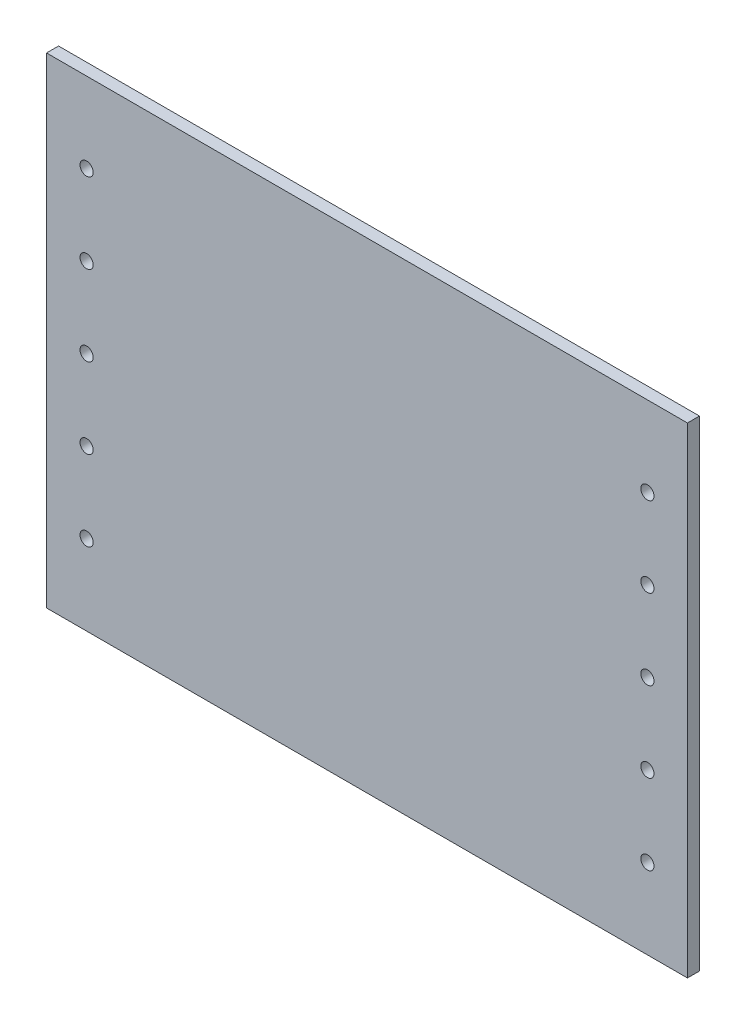
ISO-10303-21;
HEADER;
FILE_DESCRIPTION(('STEP AP214'),'2;1');
FILE_NAME('part.step','',(''),(''),'','','');
FILE_SCHEMA(('AUTOMOTIVE_DESIGN { 1 0 10303 214 1 1 1 1 }'));
ENDSEC;
DATA;
#1=APPLICATION_CONTEXT('core data for automotive mechanical design processes');
#2=APPLICATION_PROTOCOL_DEFINITION('international standard','automotive_design',2000,#1);
#3=PRODUCT_CONTEXT('',#1,'mechanical');
#4=PRODUCT('Part','Part','',(#3));
#5=PRODUCT_RELATED_PRODUCT_CATEGORY('part','',(#4));
#6=PRODUCT_DEFINITION_FORMATION('','',#4);
#7=PRODUCT_DEFINITION_CONTEXT('part definition',#1,'design');
#8=PRODUCT_DEFINITION('design','',#6,#7);
#9=PRODUCT_DEFINITION_SHAPE('','',#8);
#10=(LENGTH_UNIT() NAMED_UNIT(*) SI_UNIT(.MILLI.,.METRE.));
#11=(NAMED_UNIT(*) PLANE_ANGLE_UNIT() SI_UNIT($,.RADIAN.));
#12=(NAMED_UNIT(*) SI_UNIT($,.STERADIAN.) SOLID_ANGLE_UNIT());
#13=UNCERTAINTY_MEASURE_WITH_UNIT(LENGTH_MEASURE(1.E-05),#10,'distance_accuracy_value','');
#14=(GEOMETRIC_REPRESENTATION_CONTEXT(3) GLOBAL_UNCERTAINTY_ASSIGNED_CONTEXT((#13)) GLOBAL_UNIT_ASSIGNED_CONTEXT((#10,
#11,#12)) REPRESENTATION_CONTEXT('',''));
#15=CARTESIAN_POINT('',(0.,0.,0.));
#16=DIRECTION('',(0.,0.,1.));
#17=DIRECTION('',(1.,0.,0.));
#18=AXIS2_PLACEMENT_3D('',#15,#16,#17);
#19=CARTESIAN_POINT('',(0.,0.,3.));
#20=DIRECTION('',(0.,0.,1.));
#21=DIRECTION('',(1.,0.,0.));
#22=AXIS2_PLACEMENT_3D('',#19,#20,#21);
#23=PLANE('',#22);
#24=CARTESIAN_POINT('',(70.,20.,3.));
#25=DIRECTION('',(0.,0.,1.));
#26=DIRECTION('',(-1.,0.,0.));
#27=AXIS2_PLACEMENT_3D('',#24,#25,#26);
#28=CIRCLE('',#27,1.65);
#29=CARTESIAN_POINT('',(68.35,20.,3.));
#30=VERTEX_POINT('',#29);
#31=EDGE_CURVE('E165',#30,#30,#28,.T.);
#32=ORIENTED_EDGE('',*,*,#31,.F.);
#33=EDGE_LOOP('',(#32));
#34=FACE_BOUND('',#33,.T.);
#35=CARTESIAN_POINT('',(70.,-20.,3.));
#36=DIRECTION('',(0.,0.,1.));
#37=DIRECTION('',(-1.,0.,0.));
#38=AXIS2_PLACEMENT_3D('',#35,#36,#37);
#39=CIRCLE('',#38,1.64999999999999);
#40=CARTESIAN_POINT('',(68.35,-20.,3.));
#41=VERTEX_POINT('',#40);
#42=EDGE_CURVE('E153',#41,#41,#39,.T.);
#43=ORIENTED_EDGE('',*,*,#42,.F.);
#44=EDGE_LOOP('',(#43));
#45=FACE_BOUND('',#44,.T.);
#46=CARTESIAN_POINT('',(-70.,-40.,3.));
#47=DIRECTION('',(0.,0.,1.));
#48=DIRECTION('',(1.,0.,0.));
#49=AXIS2_PLACEMENT_3D('',#46,#47,#48);
#50=CIRCLE('',#49,1.65);
#51=CARTESIAN_POINT('',(-68.35,-40.,3.));
#52=VERTEX_POINT('',#51);
#53=EDGE_CURVE('E141',#52,#52,#50,.T.);
#54=ORIENTED_EDGE('',*,*,#53,.F.);
#55=EDGE_LOOP('',(#54));
#56=FACE_BOUND('',#55,.T.);
#57=CARTESIAN_POINT('',(-70.,0.,3.));
#58=DIRECTION('',(0.,0.,1.));
#59=DIRECTION('',(1.,0.,0.));
#60=AXIS2_PLACEMENT_3D('',#57,#58,#59);
#61=CIRCLE('',#60,1.65);
#62=CARTESIAN_POINT('',(-68.35,0.,3.));
#63=VERTEX_POINT('',#62);
#64=EDGE_CURVE('E129',#63,#63,#61,.T.);
#65=ORIENTED_EDGE('',*,*,#64,.F.);
#66=EDGE_LOOP('',(#65));
#67=FACE_BOUND('',#66,.T.);
#68=CARTESIAN_POINT('',(-70.,40.,3.));
#69=DIRECTION('',(0.,0.,1.));
#70=DIRECTION('',(1.,0.,0.));
#71=AXIS2_PLACEMENT_3D('',#68,#69,#70);
#72=CIRCLE('',#71,1.65);
#73=CARTESIAN_POINT('',(-68.35,40.,3.));
#74=VERTEX_POINT('',#73);
#75=EDGE_CURVE('E108',#74,#74,#72,.T.);
#76=ORIENTED_EDGE('',*,*,#75,.F.);
#77=EDGE_LOOP('',(#76));
#78=FACE_BOUND('',#77,.T.);
#79=DIRECTION('',(0.,1.,0.));
#80=VECTOR('',#79,1.);
#81=CARTESIAN_POINT('',(80.,60.,3.));
#82=LINE('',#81,#80);
#83=CARTESIAN_POINT('',(80.,-60.,3.));
#84=VERTEX_POINT('',#83);
#85=CARTESIAN_POINT('',(80.,60.,3.));
#86=VERTEX_POINT('',#85);
#87=EDGE_CURVE('E93',#84,#86,#82,.T.);
#88=ORIENTED_EDGE('',*,*,#87,.T.);
#89=DIRECTION('',(-1.,0.,0.));
#90=VECTOR('',#89,1.);
#91=CARTESIAN_POINT('',(-80.,60.,3.));
#92=LINE('',#91,#90);
#93=CARTESIAN_POINT('',(-80.,60.,3.));
#94=VERTEX_POINT('',#93);
#95=EDGE_CURVE('E88',#86,#94,#92,.T.);
#96=ORIENTED_EDGE('',*,*,#95,.T.);
#97=DIRECTION('',(0.,-1.,0.));
#98=VECTOR('',#97,1.);
#99=CARTESIAN_POINT('',(-80.,60.,3.));
#100=LINE('',#99,#98);
#101=CARTESIAN_POINT('',(-80.,-60.,3.));
#102=VERTEX_POINT('',#101);
#103=EDGE_CURVE('E91',#94,#102,#100,.T.);
#104=ORIENTED_EDGE('',*,*,#103,.T.);
#105=DIRECTION('',(1.,0.,0.));
#106=VECTOR('',#105,1.);
#107=CARTESIAN_POINT('',(-80.,-60.,3.));
#108=LINE('',#107,#106);
#109=EDGE_CURVE('E58',#102,#84,#108,.T.);
#110=ORIENTED_EDGE('',*,*,#109,.T.);
#111=EDGE_LOOP('',(#88,#96,#104,#110));
#112=FACE_BOUND('',#111,.T.);
#113=CARTESIAN_POINT('',(-70.,20.,3.));
#114=DIRECTION('',(0.,0.,1.));
#115=DIRECTION('',(1.,0.,0.));
#116=AXIS2_PLACEMENT_3D('',#113,#114,#115);
#117=CIRCLE('',#116,1.65);
#118=CARTESIAN_POINT('',(-68.35,20.,3.));
#119=VERTEX_POINT('',#118);
#120=EDGE_CURVE('E123',#119,#119,#117,.T.);
#121=ORIENTED_EDGE('',*,*,#120,.F.);
#122=EDGE_LOOP('',(#121));
#123=FACE_BOUND('',#122,.T.);
#124=CARTESIAN_POINT('',(-70.,-20.,3.));
#125=DIRECTION('',(0.,0.,1.));
#126=DIRECTION('',(1.,0.,0.));
#127=AXIS2_PLACEMENT_3D('',#124,#125,#126);
#128=CIRCLE('',#127,1.64999999999999);
#129=CARTESIAN_POINT('',(-68.35,-20.,3.));
#130=VERTEX_POINT('',#129);
#131=EDGE_CURVE('E135',#130,#130,#128,.T.);
#132=ORIENTED_EDGE('',*,*,#131,.F.);
#133=EDGE_LOOP('',(#132));
#134=FACE_BOUND('',#133,.T.);
#135=CARTESIAN_POINT('',(70.,-40.,3.));
#136=DIRECTION('',(0.,0.,1.));
#137=DIRECTION('',(-1.,0.,0.));
#138=AXIS2_PLACEMENT_3D('',#135,#136,#137);
#139=CIRCLE('',#138,1.65);
#140=CARTESIAN_POINT('',(68.35,-40.,3.));
#141=VERTEX_POINT('',#140);
#142=EDGE_CURVE('E147',#141,#141,#139,.T.);
#143=ORIENTED_EDGE('',*,*,#142,.F.);
#144=EDGE_LOOP('',(#143));
#145=FACE_BOUND('',#144,.T.);
#146=CARTESIAN_POINT('',(70.,0.,3.));
#147=DIRECTION('',(0.,0.,1.));
#148=DIRECTION('',(-1.,0.,0.));
#149=AXIS2_PLACEMENT_3D('',#146,#147,#148);
#150=CIRCLE('',#149,1.65);
#151=CARTESIAN_POINT('',(68.35,0.,3.));
#152=VERTEX_POINT('',#151);
#153=EDGE_CURVE('E159',#152,#152,#150,.T.);
#154=ORIENTED_EDGE('',*,*,#153,.F.);
#155=EDGE_LOOP('',(#154));
#156=FACE_BOUND('',#155,.T.);
#157=CARTESIAN_POINT('',(70.,40.,3.));
#158=DIRECTION('',(0.,0.,1.));
#159=DIRECTION('',(-1.,0.,0.));
#160=AXIS2_PLACEMENT_3D('',#157,#158,#159);
#161=CIRCLE('',#160,1.65);
#162=CARTESIAN_POINT('',(68.35,40.,3.));
#163=VERTEX_POINT('',#162);
#164=EDGE_CURVE('E171',#163,#163,#161,.T.);
#165=ORIENTED_EDGE('',*,*,#164,.F.);
#166=EDGE_LOOP('',(#165));
#167=FACE_BOUND('',#166,.T.);
#168=ADVANCED_FACE('F41',(#34,#45,#56,#67,#78,#112,#123,#134,#145,#156,#167),#23,.T.);
#169=CARTESIAN_POINT('',(0.,0.,0.));
#170=DIRECTION('',(0.,0.,1.));
#171=DIRECTION('',(1.,0.,0.));
#172=AXIS2_PLACEMENT_3D('',#169,#170,#171);
#173=PLANE('',#172);
#174=DIRECTION('',(0.,1.,0.));
#175=VECTOR('',#174,1.);
#176=CARTESIAN_POINT('',(80.,60.,0.));
#177=LINE('',#176,#175);
#178=CARTESIAN_POINT('',(80.,-60.,0.));
#179=VERTEX_POINT('',#178);
#180=CARTESIAN_POINT('',(80.,60.,0.));
#181=VERTEX_POINT('',#180);
#182=EDGE_CURVE('E105',#179,#181,#177,.T.);
#183=ORIENTED_EDGE('',*,*,#182,.F.);
#184=DIRECTION('',(1.,0.,0.));
#185=VECTOR('',#184,1.);
#186=CARTESIAN_POINT('',(-80.,-60.,0.));
#187=LINE('',#186,#185);
#188=CARTESIAN_POINT('',(-80.,-60.,0.));
#189=VERTEX_POINT('',#188);
#190=EDGE_CURVE('E81',#189,#179,#187,.T.);
#191=ORIENTED_EDGE('',*,*,#190,.F.);
#192=DIRECTION('',(0.,-1.,0.));
#193=VECTOR('',#192,1.);
#194=CARTESIAN_POINT('',(-80.,60.,0.));
#195=LINE('',#194,#193);
#196=CARTESIAN_POINT('',(-80.,60.,0.));
#197=VERTEX_POINT('',#196);
#198=EDGE_CURVE('E75',#197,#189,#195,.T.);
#199=ORIENTED_EDGE('',*,*,#198,.F.);
#200=DIRECTION('',(-1.,0.,0.));
#201=VECTOR('',#200,1.);
#202=CARTESIAN_POINT('',(-80.,60.,0.));
#203=LINE('',#202,#201);
#204=EDGE_CURVE('E97',#181,#197,#203,.T.);
#205=ORIENTED_EDGE('',*,*,#204,.F.);
#206=EDGE_LOOP('',(#183,#191,#199,#205));
#207=FACE_BOUND('',#206,.T.);
#208=CARTESIAN_POINT('',(-70.,40.,0.));
#209=DIRECTION('',(0.,0.,1.));
#210=DIRECTION('',(1.,0.,0.));
#211=AXIS2_PLACEMENT_3D('',#208,#209,#210);
#212=CIRCLE('',#211,1.65);
#213=CARTESIAN_POINT('',(-68.35,40.,0.));
#214=VERTEX_POINT('',#213);
#215=EDGE_CURVE('E120',#214,#214,#212,.T.);
#216=ORIENTED_EDGE('',*,*,#215,.T.);
#217=EDGE_LOOP('',(#216));
#218=FACE_BOUND('',#217,.T.);
#219=CARTESIAN_POINT('',(-70.,20.,0.));
#220=DIRECTION('',(0.,0.,1.));
#221=DIRECTION('',(1.,0.,0.));
#222=AXIS2_PLACEMENT_3D('',#219,#220,#221);
#223=CIRCLE('',#222,1.65);
#224=CARTESIAN_POINT('',(-68.35,20.,0.));
#225=VERTEX_POINT('',#224);
#226=EDGE_CURVE('E126',#225,#225,#223,.T.);
#227=ORIENTED_EDGE('',*,*,#226,.T.);
#228=EDGE_LOOP('',(#227));
#229=FACE_BOUND('',#228,.T.);
#230=CARTESIAN_POINT('',(-70.,0.,0.));
#231=DIRECTION('',(0.,0.,1.));
#232=DIRECTION('',(1.,0.,0.));
#233=AXIS2_PLACEMENT_3D('',#230,#231,#232);
#234=CIRCLE('',#233,1.65);
#235=CARTESIAN_POINT('',(-68.35,0.,0.));
#236=VERTEX_POINT('',#235);
#237=EDGE_CURVE('E132',#236,#236,#234,.T.);
#238=ORIENTED_EDGE('',*,*,#237,.T.);
#239=EDGE_LOOP('',(#238));
#240=FACE_BOUND('',#239,.T.);
#241=CARTESIAN_POINT('',(-70.,-20.,0.));
#242=DIRECTION('',(0.,0.,1.));
#243=DIRECTION('',(1.,0.,0.));
#244=AXIS2_PLACEMENT_3D('',#241,#242,#243);
#245=CIRCLE('',#244,1.64999999999999);
#246=CARTESIAN_POINT('',(-68.35,-20.,0.));
#247=VERTEX_POINT('',#246);
#248=EDGE_CURVE('E138',#247,#247,#245,.T.);
#249=ORIENTED_EDGE('',*,*,#248,.T.);
#250=EDGE_LOOP('',(#249));
#251=FACE_BOUND('',#250,.T.);
#252=CARTESIAN_POINT('',(-70.,-40.,0.));
#253=DIRECTION('',(0.,0.,1.));
#254=DIRECTION('',(1.,0.,0.));
#255=AXIS2_PLACEMENT_3D('',#252,#253,#254);
#256=CIRCLE('',#255,1.65);
#257=CARTESIAN_POINT('',(-68.35,-40.,0.));
#258=VERTEX_POINT('',#257);
#259=EDGE_CURVE('E144',#258,#258,#256,.T.);
#260=ORIENTED_EDGE('',*,*,#259,.T.);
#261=EDGE_LOOP('',(#260));
#262=FACE_BOUND('',#261,.T.);
#263=CARTESIAN_POINT('',(70.,-40.,0.));
#264=DIRECTION('',(0.,0.,1.));
#265=DIRECTION('',(-1.,0.,0.));
#266=AXIS2_PLACEMENT_3D('',#263,#264,#265);
#267=CIRCLE('',#266,1.65);
#268=CARTESIAN_POINT('',(68.35,-40.,0.));
#269=VERTEX_POINT('',#268);
#270=EDGE_CURVE('E150',#269,#269,#267,.T.);
#271=ORIENTED_EDGE('',*,*,#270,.T.);
#272=EDGE_LOOP('',(#271));
#273=FACE_BOUND('',#272,.T.);
#274=CARTESIAN_POINT('',(70.,-20.,0.));
#275=DIRECTION('',(0.,0.,1.));
#276=DIRECTION('',(-1.,0.,0.));
#277=AXIS2_PLACEMENT_3D('',#274,#275,#276);
#278=CIRCLE('',#277,1.64999999999999);
#279=CARTESIAN_POINT('',(68.35,-20.,0.));
#280=VERTEX_POINT('',#279);
#281=EDGE_CURVE('E156',#280,#280,#278,.T.);
#282=ORIENTED_EDGE('',*,*,#281,.T.);
#283=EDGE_LOOP('',(#282));
#284=FACE_BOUND('',#283,.T.);
#285=CARTESIAN_POINT('',(70.,0.,0.));
#286=DIRECTION('',(0.,0.,1.));
#287=DIRECTION('',(-1.,0.,0.));
#288=AXIS2_PLACEMENT_3D('',#285,#286,#287);
#289=CIRCLE('',#288,1.65);
#290=CARTESIAN_POINT('',(68.35,0.,0.));
#291=VERTEX_POINT('',#290);
#292=EDGE_CURVE('E162',#291,#291,#289,.T.);
#293=ORIENTED_EDGE('',*,*,#292,.T.);
#294=EDGE_LOOP('',(#293));
#295=FACE_BOUND('',#294,.T.);
#296=CARTESIAN_POINT('',(70.,20.,0.));
#297=DIRECTION('',(0.,0.,1.));
#298=DIRECTION('',(-1.,0.,0.));
#299=AXIS2_PLACEMENT_3D('',#296,#297,#298);
#300=CIRCLE('',#299,1.65);
#301=CARTESIAN_POINT('',(68.35,20.,0.));
#302=VERTEX_POINT('',#301);
#303=EDGE_CURVE('E168',#302,#302,#300,.T.);
#304=ORIENTED_EDGE('',*,*,#303,.T.);
#305=EDGE_LOOP('',(#304));
#306=FACE_BOUND('',#305,.T.);
#307=CARTESIAN_POINT('',(70.,40.,0.));
#308=DIRECTION('',(0.,0.,1.));
#309=DIRECTION('',(-1.,0.,0.));
#310=AXIS2_PLACEMENT_3D('',#307,#308,#309);
#311=CIRCLE('',#310,1.65);
#312=CARTESIAN_POINT('',(68.35,40.,0.));
#313=VERTEX_POINT('',#312);
#314=EDGE_CURVE('E174',#313,#313,#311,.T.);
#315=ORIENTED_EDGE('',*,*,#314,.T.);
#316=EDGE_LOOP('',(#315));
#317=FACE_BOUND('',#316,.T.);
#318=ADVANCED_FACE('F116',(#207,#218,#229,#240,#251,#262,#273,#284,#295,#306,#317),#173,.F.);
#319=CARTESIAN_POINT('',(80.,60.,3.));
#320=DIRECTION('',(-1.,0.,0.));
#321=DIRECTION('',(0.,0.,1.));
#322=AXIS2_PLACEMENT_3D('',#319,#320,#321);
#323=PLANE('',#322);
#324=ORIENTED_EDGE('',*,*,#182,.T.);
#325=DIRECTION('',(0.,0.,-1.));
#326=VECTOR('',#325,1.);
#327=CARTESIAN_POINT('',(80.,60.,3.));
#328=LINE('',#327,#326);
#329=EDGE_CURVE('E11',#86,#181,#328,.T.);
#330=ORIENTED_EDGE('',*,*,#329,.F.);
#331=ORIENTED_EDGE('',*,*,#87,.F.);
#332=DIRECTION('',(0.,0.,-1.));
#333=VECTOR('',#332,1.);
#334=CARTESIAN_POINT('',(80.,-60.,3.));
#335=LINE('',#334,#333);
#336=EDGE_CURVE('E101',#84,#179,#335,.T.);
#337=ORIENTED_EDGE('',*,*,#336,.T.);
#338=EDGE_LOOP('',(#324,#330,#331,#337));
#339=FACE_BOUND('',#338,.T.);
#340=ADVANCED_FACE('F43',(#339),#323,.F.);
#341=CARTESIAN_POINT('',(-80.,60.,3.));
#342=DIRECTION('',(0.,-1.,0.));
#343=DIRECTION('',(0.,0.,-1.));
#344=AXIS2_PLACEMENT_3D('',#341,#342,#343);
#345=PLANE('',#344);
#346=ORIENTED_EDGE('',*,*,#204,.T.);
#347=DIRECTION('',(0.,0.,-1.));
#348=VECTOR('',#347,1.);
#349=CARTESIAN_POINT('',(-80.,60.,3.));
#350=LINE('',#349,#348);
#351=EDGE_CURVE('E50',#94,#197,#350,.T.);
#352=ORIENTED_EDGE('',*,*,#351,.F.);
#353=ORIENTED_EDGE('',*,*,#95,.F.);
#354=ORIENTED_EDGE('',*,*,#329,.T.);
#355=EDGE_LOOP('',(#346,#352,#353,#354));
#356=FACE_BOUND('',#355,.T.);
#357=ADVANCED_FACE('F96',(#356),#345,.F.);
#358=CARTESIAN_POINT('',(-80.,60.,3.));
#359=DIRECTION('',(1.,0.,0.));
#360=DIRECTION('',(0.,1.,0.));
#361=AXIS2_PLACEMENT_3D('',#358,#359,#360);
#362=PLANE('',#361);
#363=ORIENTED_EDGE('',*,*,#198,.T.);
#364=DIRECTION('',(0.,0.,-1.));
#365=VECTOR('',#364,1.);
#366=CARTESIAN_POINT('',(-80.,-60.,3.));
#367=LINE('',#366,#365);
#368=EDGE_CURVE('E98',#102,#189,#367,.T.);
#369=ORIENTED_EDGE('',*,*,#368,.F.);
#370=ORIENTED_EDGE('',*,*,#103,.F.);
#371=ORIENTED_EDGE('',*,*,#351,.T.);
#372=EDGE_LOOP('',(#363,#369,#370,#371));
#373=FACE_BOUND('',#372,.T.);
#374=ADVANCED_FACE('F99',(#373),#362,.F.);
#375=CARTESIAN_POINT('',(-80.,-60.,3.));
#376=DIRECTION('',(0.,1.,0.));
#377=DIRECTION('',(0.,0.,1.));
#378=AXIS2_PLACEMENT_3D('',#375,#376,#377);
#379=PLANE('',#378);
#380=ORIENTED_EDGE('',*,*,#190,.T.);
#381=ORIENTED_EDGE('',*,*,#336,.F.);
#382=ORIENTED_EDGE('',*,*,#109,.F.);
#383=ORIENTED_EDGE('',*,*,#368,.T.);
#384=EDGE_LOOP('',(#380,#381,#382,#383));
#385=FACE_BOUND('',#384,.T.);
#386=ADVANCED_FACE('F113',(#385),#379,.F.);
#387=CARTESIAN_POINT('',(-70.,40.,3.));
#388=DIRECTION('',(0.,0.,-1.));
#389=DIRECTION('',(-1.,0.,0.));
#390=AXIS2_PLACEMENT_3D('',#387,#388,#389);
#391=CYLINDRICAL_SURFACE('',#390,1.65);
#392=ORIENTED_EDGE('',*,*,#75,.T.);
#393=EDGE_LOOP('',(#392));
#394=FACE_BOUND('',#393,.T.);
#395=ORIENTED_EDGE('',*,*,#215,.F.);
#396=EDGE_LOOP('',(#395));
#397=FACE_BOUND('',#396,.T.);
#398=ADVANCED_FACE('F193',(#394,#397),#391,.F.);
#399=CARTESIAN_POINT('',(-70.,20.,3.));
#400=DIRECTION('',(0.,0.,-1.));
#401=DIRECTION('',(-1.,0.,0.));
#402=AXIS2_PLACEMENT_3D('',#399,#400,#401);
#403=CYLINDRICAL_SURFACE('',#402,1.65);
#404=ORIENTED_EDGE('',*,*,#120,.T.);
#405=EDGE_LOOP('',(#404));
#406=FACE_BOUND('',#405,.T.);
#407=ORIENTED_EDGE('',*,*,#226,.F.);
#408=EDGE_LOOP('',(#407));
#409=FACE_BOUND('',#408,.T.);
#410=ADVANCED_FACE('F238',(#406,#409),#403,.F.);
#411=CARTESIAN_POINT('',(-70.,0.,3.));
#412=DIRECTION('',(0.,0.,-1.));
#413=DIRECTION('',(-1.,0.,0.));
#414=AXIS2_PLACEMENT_3D('',#411,#412,#413);
#415=CYLINDRICAL_SURFACE('',#414,1.65);
#416=ORIENTED_EDGE('',*,*,#64,.T.);
#417=EDGE_LOOP('',(#416));
#418=FACE_BOUND('',#417,.T.);
#419=ORIENTED_EDGE('',*,*,#237,.F.);
#420=EDGE_LOOP('',(#419));
#421=FACE_BOUND('',#420,.T.);
#422=ADVANCED_FACE('F246',(#418,#421),#415,.F.);
#423=CARTESIAN_POINT('',(-70.,-20.,3.));
#424=DIRECTION('',(0.,0.,-1.));
#425=DIRECTION('',(-1.,0.,0.));
#426=AXIS2_PLACEMENT_3D('',#423,#424,#425);
#427=CYLINDRICAL_SURFACE('',#426,1.64999999999999);
#428=ORIENTED_EDGE('',*,*,#131,.T.);
#429=EDGE_LOOP('',(#428));
#430=FACE_BOUND('',#429,.T.);
#431=ORIENTED_EDGE('',*,*,#248,.F.);
#432=EDGE_LOOP('',(#431));
#433=FACE_BOUND('',#432,.T.);
#434=ADVANCED_FACE('F254',(#430,#433),#427,.F.);
#435=CARTESIAN_POINT('',(-70.,-40.,3.));
#436=DIRECTION('',(0.,0.,-1.));
#437=DIRECTION('',(-1.,0.,0.));
#438=AXIS2_PLACEMENT_3D('',#435,#436,#437);
#439=CYLINDRICAL_SURFACE('',#438,1.65);
#440=ORIENTED_EDGE('',*,*,#53,.T.);
#441=EDGE_LOOP('',(#440));
#442=FACE_BOUND('',#441,.T.);
#443=ORIENTED_EDGE('',*,*,#259,.F.);
#444=EDGE_LOOP('',(#443));
#445=FACE_BOUND('',#444,.T.);
#446=ADVANCED_FACE('F263',(#442,#445),#439,.F.);
#447=CARTESIAN_POINT('',(70.,-40.,3.));
#448=DIRECTION('',(0.,0.,-1.));
#449=DIRECTION('',(-1.,0.,0.));
#450=AXIS2_PLACEMENT_3D('',#447,#448,#449);
#451=CYLINDRICAL_SURFACE('',#450,1.65);
#452=ORIENTED_EDGE('',*,*,#142,.T.);
#453=EDGE_LOOP('',(#452));
#454=FACE_BOUND('',#453,.T.);
#455=ORIENTED_EDGE('',*,*,#270,.F.);
#456=EDGE_LOOP('',(#455));
#457=FACE_BOUND('',#456,.T.);
#458=ADVANCED_FACE('F272',(#454,#457),#451,.F.);
#459=CARTESIAN_POINT('',(70.,-20.,3.));
#460=DIRECTION('',(0.,0.,-1.));
#461=DIRECTION('',(-1.,0.,0.));
#462=AXIS2_PLACEMENT_3D('',#459,#460,#461);
#463=CYLINDRICAL_SURFACE('',#462,1.64999999999999);
#464=ORIENTED_EDGE('',*,*,#42,.T.);
#465=EDGE_LOOP('',(#464));
#466=FACE_BOUND('',#465,.T.);
#467=ORIENTED_EDGE('',*,*,#281,.F.);
#468=EDGE_LOOP('',(#467));
#469=FACE_BOUND('',#468,.T.);
#470=ADVANCED_FACE('F281',(#466,#469),#463,.F.);
#471=CARTESIAN_POINT('',(70.,0.,3.));
#472=DIRECTION('',(0.,0.,-1.));
#473=DIRECTION('',(-1.,0.,0.));
#474=AXIS2_PLACEMENT_3D('',#471,#472,#473);
#475=CYLINDRICAL_SURFACE('',#474,1.65);
#476=ORIENTED_EDGE('',*,*,#153,.T.);
#477=EDGE_LOOP('',(#476));
#478=FACE_BOUND('',#477,.T.);
#479=ORIENTED_EDGE('',*,*,#292,.F.);
#480=EDGE_LOOP('',(#479));
#481=FACE_BOUND('',#480,.T.);
#482=ADVANCED_FACE('F290',(#478,#481),#475,.F.);
#483=CARTESIAN_POINT('',(70.,20.,3.));
#484=DIRECTION('',(0.,0.,-1.));
#485=DIRECTION('',(-1.,0.,0.));
#486=AXIS2_PLACEMENT_3D('',#483,#484,#485);
#487=CYLINDRICAL_SURFACE('',#486,1.65);
#488=ORIENTED_EDGE('',*,*,#31,.T.);
#489=EDGE_LOOP('',(#488));
#490=FACE_BOUND('',#489,.T.);
#491=ORIENTED_EDGE('',*,*,#303,.F.);
#492=EDGE_LOOP('',(#491));
#493=FACE_BOUND('',#492,.T.);
#494=ADVANCED_FACE('F299',(#490,#493),#487,.F.);
#495=CARTESIAN_POINT('',(70.,40.,3.));
#496=DIRECTION('',(0.,0.,-1.));
#497=DIRECTION('',(-1.,0.,0.));
#498=AXIS2_PLACEMENT_3D('',#495,#496,#497);
#499=CYLINDRICAL_SURFACE('',#498,1.65);
#500=ORIENTED_EDGE('',*,*,#164,.T.);
#501=EDGE_LOOP('',(#500));
#502=FACE_BOUND('',#501,.T.);
#503=ORIENTED_EDGE('',*,*,#314,.F.);
#504=EDGE_LOOP('',(#503));
#505=FACE_BOUND('',#504,.T.);
#506=ADVANCED_FACE('F180',(#502,#505),#499,.F.);
#507=CLOSED_SHELL('',(#168,#318,#340,#357,#374,#386,#398,#410,#422,#434,#446,#458,#470,#482,
#494,#506));
#508=MANIFOLD_SOLID_BREP('B2',#507);
#509=ADVANCED_BREP_SHAPE_REPRESENTATION('',(#18,#508),#14);
#510=SHAPE_DEFINITION_REPRESENTATION(#9,#509);
ENDSEC;
END-ISO-10303-21;
